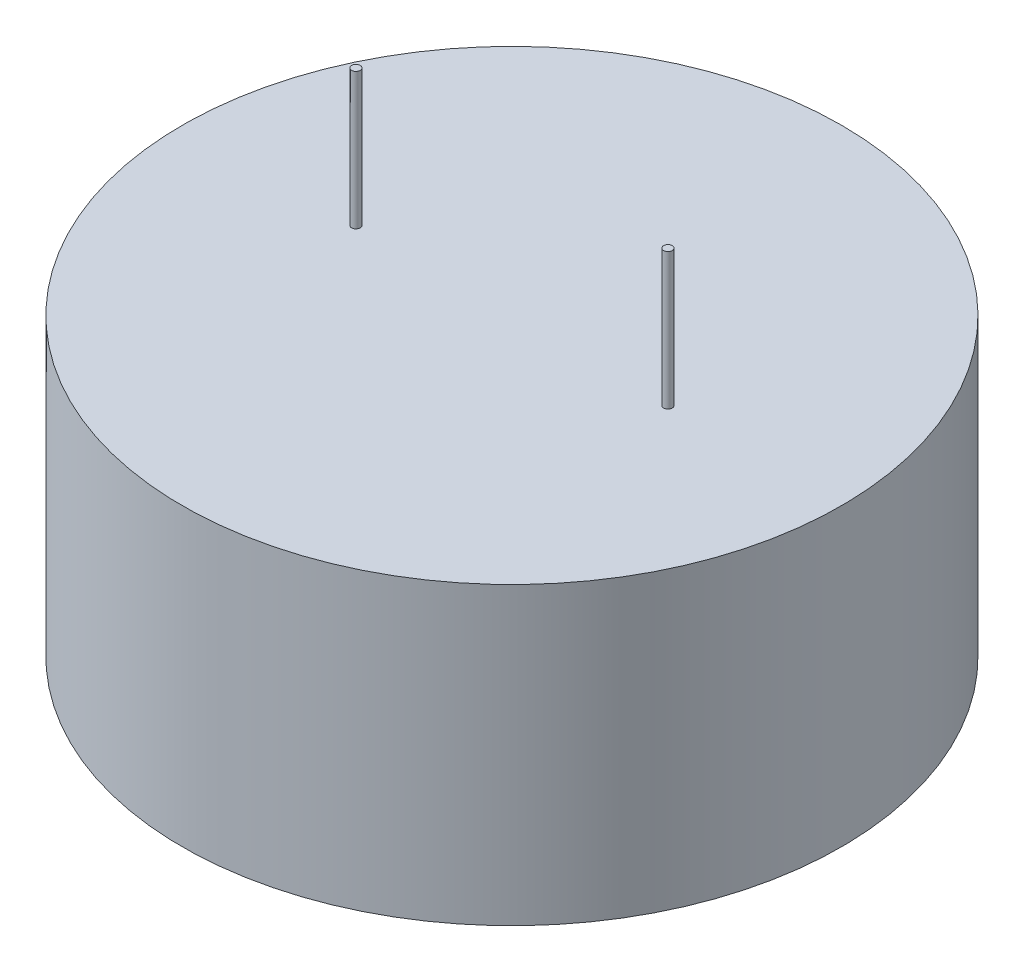
ISO-10303-21;
HEADER;
FILE_DESCRIPTION(('STEP AP214'),'2;1');
FILE_NAME('part.step','',(''),(''),'','','');
FILE_SCHEMA(('AUTOMOTIVE_DESIGN { 1 0 10303 214 1 1 1 1 }'));
ENDSEC;
DATA;
#1=APPLICATION_CONTEXT('core data for automotive mechanical design processes');
#2=APPLICATION_PROTOCOL_DEFINITION('international standard','automotive_design',2000,#1);
#3=PRODUCT_CONTEXT('',#1,'mechanical');
#4=PRODUCT('Part','Part','',(#3));
#5=PRODUCT_RELATED_PRODUCT_CATEGORY('part','',(#4));
#6=PRODUCT_DEFINITION_FORMATION('','',#4);
#7=PRODUCT_DEFINITION_CONTEXT('part definition',#1,'design');
#8=PRODUCT_DEFINITION('design','',#6,#7);
#9=PRODUCT_DEFINITION_SHAPE('','',#8);
#10=(LENGTH_UNIT() NAMED_UNIT(*) SI_UNIT(.MILLI.,.METRE.));
#11=(NAMED_UNIT(*) PLANE_ANGLE_UNIT() SI_UNIT($,.RADIAN.));
#12=(NAMED_UNIT(*) SI_UNIT($,.STERADIAN.) SOLID_ANGLE_UNIT());
#13=UNCERTAINTY_MEASURE_WITH_UNIT(LENGTH_MEASURE(1.E-05),#10,'distance_accuracy_value','');
#14=(GEOMETRIC_REPRESENTATION_CONTEXT(3) GLOBAL_UNCERTAINTY_ASSIGNED_CONTEXT((#13)) GLOBAL_UNIT_ASSIGNED_CONTEXT((#10,
#11,#12)) REPRESENTATION_CONTEXT('',''));
#15=CARTESIAN_POINT('',(0.,0.,0.));
#16=DIRECTION('',(0.,0.,1.));
#17=DIRECTION('',(1.,0.,0.));
#18=AXIS2_PLACEMENT_3D('',#15,#16,#17);
#19=CARTESIAN_POINT('',(0.,13.,0.));
#20=DIRECTION('',(0.,-1.,0.));
#21=DIRECTION('',(0.,0.,-1.));
#22=AXIS2_PLACEMENT_3D('',#19,#20,#21);
#23=CYLINDRICAL_SURFACE('',#22,14.5);
#24=CARTESIAN_POINT('',(0.,13.,0.));
#25=DIRECTION('',(0.,1.,0.));
#26=DIRECTION('',(0.,0.,1.));
#27=AXIS2_PLACEMENT_3D('',#24,#25,#26);
#28=CIRCLE('',#27,14.5);
#29=CARTESIAN_POINT('',(0.,13.,-14.5));
#30=VERTEX_POINT('',#29);
#31=EDGE_CURVE('E44',#30,#30,#28,.T.);
#32=CARTESIAN_POINT('',(0.,0.,0.));
#33=DIRECTION('',(0.,1.,0.));
#34=DIRECTION('',(0.,0.,1.));
#35=AXIS2_PLACEMENT_3D('',#32,#33,#34);
#36=CIRCLE('',#35,14.5);
#37=CARTESIAN_POINT('',(0.,0.,-14.5));
#38=VERTEX_POINT('',#37);
#39=EDGE_CURVE('E49',#38,#38,#36,.T.);
#40=CARTESIAN_POINT('',(0.,13.,-14.5));
#41=CARTESIAN_POINT('',(0.,12.8645833333333,-14.5));
#42=CARTESIAN_POINT('',(0.,12.7291666666667,-14.5));
#43=CARTESIAN_POINT('',(0.,12.4583333333333,-14.5));
#44=CARTESIAN_POINT('',(0.,12.3229166666667,-14.5));
#45=CARTESIAN_POINT('',(0.,12.0520833333333,-14.5));
#46=CARTESIAN_POINT('',(0.,11.9166666666667,-14.5));
#47=CARTESIAN_POINT('',(0.,11.6458333333333,-14.5));
#48=CARTESIAN_POINT('',(0.,11.5104166666667,-14.5));
#49=CARTESIAN_POINT('',(0.,11.2395833333333,-14.5));
#50=CARTESIAN_POINT('',(0.,11.1041666666667,-14.5));
#51=CARTESIAN_POINT('',(0.,10.8333333333333,-14.5));
#52=CARTESIAN_POINT('',(0.,10.6979166666667,-14.5));
#53=CARTESIAN_POINT('',(0.,10.4270833333333,-14.5));
#54=CARTESIAN_POINT('',(0.,10.2916666666667,-14.5));
#55=CARTESIAN_POINT('',(0.,10.0208333333333,-14.5));
#56=CARTESIAN_POINT('',(0.,9.88541666666667,-14.5));
#57=CARTESIAN_POINT('',(0.,9.61458333333333,-14.5));
#58=CARTESIAN_POINT('',(0.,9.47916666666667,-14.5));
#59=CARTESIAN_POINT('',(0.,9.20833333333333,-14.5));
#60=CARTESIAN_POINT('',(0.,9.07291666666667,-14.5));
#61=CARTESIAN_POINT('',(0.,8.80208333333333,-14.5));
#62=CARTESIAN_POINT('',(0.,8.66666666666667,-14.5));
#63=CARTESIAN_POINT('',(0.,8.39583333333333,-14.5));
#64=CARTESIAN_POINT('',(0.,8.26041666666667,-14.5));
#65=CARTESIAN_POINT('',(0.,7.98958333333333,-14.5));
#66=CARTESIAN_POINT('',(0.,7.85416666666667,-14.5));
#67=CARTESIAN_POINT('',(0.,7.58333333333333,-14.5));
#68=CARTESIAN_POINT('',(0.,7.44791666666667,-14.5));
#69=CARTESIAN_POINT('',(0.,7.17708333333333,-14.5));
#70=CARTESIAN_POINT('',(0.,7.04166666666667,-14.5));
#71=CARTESIAN_POINT('',(0.,6.77083333333333,-14.5));
#72=CARTESIAN_POINT('',(0.,6.63541666666667,-14.5));
#73=CARTESIAN_POINT('',(0.,6.36458333333333,-14.5));
#74=CARTESIAN_POINT('',(0.,6.22916666666667,-14.5));
#75=CARTESIAN_POINT('',(0.,5.95833333333333,-14.5));
#76=CARTESIAN_POINT('',(0.,5.82291666666667,-14.5));
#77=CARTESIAN_POINT('',(0.,5.55208333333333,-14.5));
#78=CARTESIAN_POINT('',(0.,5.41666666666667,-14.5));
#79=CARTESIAN_POINT('',(0.,5.14583333333333,-14.5));
#80=CARTESIAN_POINT('',(0.,5.01041666666667,-14.5));
#81=CARTESIAN_POINT('',(0.,4.73958333333333,-14.5));
#82=CARTESIAN_POINT('',(0.,4.60416666666667,-14.5));
#83=CARTESIAN_POINT('',(0.,4.33333333333333,-14.5));
#84=CARTESIAN_POINT('',(0.,4.19791666666667,-14.5));
#85=CARTESIAN_POINT('',(0.,3.92708333333333,-14.5));
#86=CARTESIAN_POINT('',(0.,3.79166666666667,-14.5));
#87=CARTESIAN_POINT('',(0.,3.52083333333333,-14.5));
#88=CARTESIAN_POINT('',(0.,3.38541666666667,-14.5));
#89=CARTESIAN_POINT('',(0.,3.11458333333333,-14.5));
#90=CARTESIAN_POINT('',(0.,2.97916666666667,-14.5));
#91=CARTESIAN_POINT('',(0.,2.70833333333333,-14.5));
#92=CARTESIAN_POINT('',(0.,2.57291666666667,-14.5));
#93=CARTESIAN_POINT('',(0.,2.30208333333333,-14.5));
#94=CARTESIAN_POINT('',(0.,2.16666666666667,-14.5));
#95=CARTESIAN_POINT('',(0.,1.89583333333333,-14.5));
#96=CARTESIAN_POINT('',(0.,1.76041666666667,-14.5));
#97=CARTESIAN_POINT('',(0.,1.48958333333333,-14.5));
#98=CARTESIAN_POINT('',(0.,1.35416666666667,-14.5));
#99=CARTESIAN_POINT('',(0.,1.08333333333333,-14.5));
#100=CARTESIAN_POINT('',(0.,0.947916666666667,-14.5));
#101=CARTESIAN_POINT('',(0.,0.677083333333334,-14.5));
#102=CARTESIAN_POINT('',(0.,0.541666666666667,-14.5));
#103=CARTESIAN_POINT('',(0.,0.270833333333334,-14.5));
#104=CARTESIAN_POINT('',(0.,0.135416666666667,-14.5));
#105=CARTESIAN_POINT('',(0.,0.,-14.5));
#106=B_SPLINE_CURVE_WITH_KNOTS('',3,(#40,#41,#42,#43,#44,#45,#46,#47,#48,#49,#50,#51,#52,#53,
#54,#55,#56,#57,#58,#59,#60,#61,#62,#63,#64,#65,#66,#67,#68,#69,#70,#71,#72,#73,#74,#75,#76,#77,
#78,#79,#80,#81,#82,#83,#84,#85,#86,#87,#88,#89,#90,#91,#92,#93,#94,#95,#96,#97,#98,#99,#100,
#101,#102,#103,#104,#105),.UNSPECIFIED.,.F.,.F.,(4,2,2,2,2,2,2,2,2,2,2,2,2,2,2,2,2,2,2,2,2,2,2,
2,2,2,2,2,2,2,2,2,4),(0.,0.406249999999999,0.812499999999999,1.21875,1.625,2.03125,2.4375,
2.84375,3.25,3.65625,4.0625,4.46875,4.875,5.28125,5.6875,6.09375,6.5,6.90625,7.3125,7.71875,
8.125,8.53125,8.9375,9.34375,9.75,10.15625,10.5625,10.96875,11.375,11.78125,12.1875,12.59375,
13.),.UNSPECIFIED.);
#107=EDGE_CURVE('BSEAM37',#30,#38,#106,.T.);
#108=ORIENTED_EDGE('',*,*,#31,.F.);
#109=ORIENTED_EDGE('',*,*,#39,.T.);
#110=ORIENTED_EDGE('',*,*,#107,.T.);
#111=ORIENTED_EDGE('',*,*,#107,.F.);
#112=EDGE_LOOP('',(#108,#110,#109,#111));
#113=FACE_BOUND('',#112,.T.);
#114=ADVANCED_FACE('F37',(#113),#23,.T.);
#115=CARTESIAN_POINT('',(0.,13.,0.));
#116=DIRECTION('',(0.,1.,0.));
#117=DIRECTION('',(0.,0.,1.));
#118=AXIS2_PLACEMENT_3D('',#115,#116,#117);
#119=PLANE('',#118);
#120=CARTESIAN_POINT('',(6.86487671634231,13.,0.));
#121=DIRECTION('',(0.,1.,0.));
#122=DIRECTION('',(0.,0.,1.));
#123=AXIS2_PLACEMENT_3D('',#120,#121,#122);
#124=CIRCLE('',#123,0.190045056699596);
#125=CARTESIAN_POINT('',(6.86487671634231,13.,0.190045056699596));
#126=VERTEX_POINT('',#125);
#127=EDGE_CURVE('E10',#126,#126,#124,.T.);
#128=ORIENTED_EDGE('',*,*,#127,.F.);
#129=EDGE_LOOP('',(#128));
#130=FACE_BOUND('',#129,.T.);
#131=CARTESIAN_POINT('',(-6.86487671634231,13.,0.));
#132=DIRECTION('',(0.,1.,0.));
#133=DIRECTION('',(0.,0.,1.));
#134=AXIS2_PLACEMENT_3D('',#131,#132,#133);
#135=CIRCLE('',#134,0.190045056699596);
#136=CARTESIAN_POINT('',(-6.86487671634231,13.,0.190045056699596));
#137=VERTEX_POINT('',#136);
#138=EDGE_CURVE('E57',#137,#137,#135,.T.);
#139=ORIENTED_EDGE('',*,*,#138,.F.);
#140=EDGE_LOOP('',(#139));
#141=FACE_BOUND('',#140,.T.);
#142=ORIENTED_EDGE('',*,*,#31,.T.);
#143=EDGE_LOOP('',(#142));
#144=FACE_BOUND('',#143,.T.);
#145=ADVANCED_FACE('F80',(#130,#141,#144),#119,.T.);
#146=CARTESIAN_POINT('',(0.,0.,0.));
#147=DIRECTION('',(0.,1.,0.));
#148=DIRECTION('',(0.,0.,1.));
#149=AXIS2_PLACEMENT_3D('',#146,#147,#148);
#150=PLANE('',#149);
#151=ORIENTED_EDGE('',*,*,#39,.F.);
#152=EDGE_LOOP('',(#151));
#153=FACE_BOUND('',#152,.T.);
#154=ADVANCED_FACE('F85',(#153),#150,.F.);
#155=CARTESIAN_POINT('',(-6.86487671634231,19.,0.));
#156=DIRECTION('',(0.,-1.,0.));
#157=DIRECTION('',(0.,0.,-1.));
#158=AXIS2_PLACEMENT_3D('',#155,#156,#157);
#159=CYLINDRICAL_SURFACE('',#158,0.190045056699596);
#160=CARTESIAN_POINT('',(-6.86487671634231,19.,0.));
#161=DIRECTION('',(0.,1.,0.));
#162=DIRECTION('',(0.,0.,1.));
#163=AXIS2_PLACEMENT_3D('',#160,#161,#162);
#164=CIRCLE('',#163,0.190045056699596);
#165=CARTESIAN_POINT('',(-6.86487671634231,19.,0.190045056699596));
#166=VERTEX_POINT('',#165);
#167=EDGE_CURVE('E55',#166,#166,#164,.T.);
#168=ORIENTED_EDGE('',*,*,#167,.F.);
#169=EDGE_LOOP('',(#168));
#170=FACE_BOUND('',#169,.T.);
#171=ORIENTED_EDGE('',*,*,#138,.T.);
#172=EDGE_LOOP('',(#171));
#173=FACE_BOUND('',#172,.T.);
#174=ADVANCED_FACE('F92',(#170,#173),#159,.T.);
#175=CARTESIAN_POINT('',(-6.86487671634231,19.,0.));
#176=DIRECTION('',(0.,1.,0.));
#177=DIRECTION('',(0.,0.,1.));
#178=AXIS2_PLACEMENT_3D('',#175,#176,#177);
#179=PLANE('',#178);
#180=ORIENTED_EDGE('',*,*,#167,.T.);
#181=EDGE_LOOP('',(#180));
#182=FACE_BOUND('',#181,.T.);
#183=ADVANCED_FACE('F77',(#182),#179,.T.);
#184=CARTESIAN_POINT('',(6.86487671634231,19.,0.));
#185=DIRECTION('',(0.,-1.,0.));
#186=DIRECTION('',(0.,0.,-1.));
#187=AXIS2_PLACEMENT_3D('',#184,#185,#186);
#188=CYLINDRICAL_SURFACE('',#187,0.190045056699596);
#189=CARTESIAN_POINT('',(6.86487671634231,19.,0.));
#190=DIRECTION('',(0.,-1.,0.));
#191=DIRECTION('',(0.,0.,1.));
#192=AXIS2_PLACEMENT_3D('',#189,#190,#191);
#193=CIRCLE('',#192,0.190045056699596);
#194=CARTESIAN_POINT('',(6.86487671634231,19.,0.190045056699596));
#195=VERTEX_POINT('',#194);
#196=EDGE_CURVE('E61',#195,#195,#193,.T.);
#197=ORIENTED_EDGE('',*,*,#196,.T.);
#198=EDGE_LOOP('',(#197));
#199=FACE_BOUND('',#198,.T.);
#200=ORIENTED_EDGE('',*,*,#127,.T.);
#201=EDGE_LOOP('',(#200));
#202=FACE_BOUND('',#201,.T.);
#203=ADVANCED_FACE('F69',(#199,#202),#188,.T.);
#204=CARTESIAN_POINT('',(6.86487671634231,19.,0.));
#205=DIRECTION('',(0.,1.,0.));
#206=DIRECTION('',(0.,0.,1.));
#207=AXIS2_PLACEMENT_3D('',#204,#205,#206);
#208=PLANE('',#207);
#209=ORIENTED_EDGE('',*,*,#196,.F.);
#210=EDGE_LOOP('',(#209));
#211=FACE_BOUND('',#210,.T.);
#212=ADVANCED_FACE('F71',(#211),#208,.T.);
#213=CLOSED_SHELL('',(#114,#145,#154,#174,#183,#203,#212));
#214=MANIFOLD_SOLID_BREP('B2',#213);
#215=ADVANCED_BREP_SHAPE_REPRESENTATION('',(#18,#214),#14);
#216=SHAPE_DEFINITION_REPRESENTATION(#9,#215);
ENDSEC;
END-ISO-10303-21;
